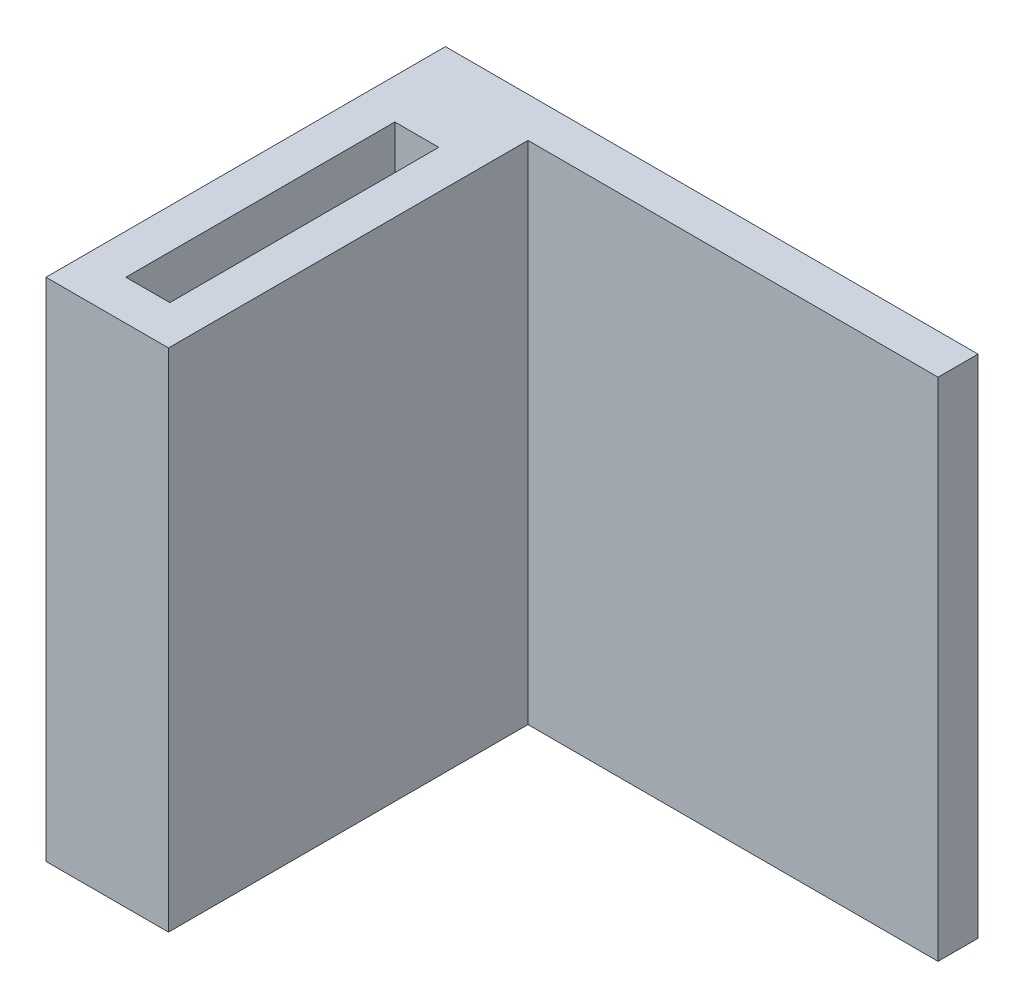
ISO-10303-21;
HEADER;
FILE_DESCRIPTION(('STEP AP214'),'2;1');
FILE_NAME('part.step','',(''),(''),'','','');
FILE_SCHEMA(('AUTOMOTIVE_DESIGN { 1 0 10303 214 1 1 1 1 }'));
ENDSEC;
DATA;
#1=APPLICATION_CONTEXT('core data for automotive mechanical design processes');
#2=APPLICATION_PROTOCOL_DEFINITION('international standard','automotive_design',2000,#1);
#3=PRODUCT_CONTEXT('',#1,'mechanical');
#4=PRODUCT('Part','Part','',(#3));
#5=PRODUCT_RELATED_PRODUCT_CATEGORY('part','',(#4));
#6=PRODUCT_DEFINITION_FORMATION('','',#4);
#7=PRODUCT_DEFINITION_CONTEXT('part definition',#1,'design');
#8=PRODUCT_DEFINITION('design','',#6,#7);
#9=PRODUCT_DEFINITION_SHAPE('','',#8);
#10=(LENGTH_UNIT() NAMED_UNIT(*) SI_UNIT(.MILLI.,.METRE.));
#11=(NAMED_UNIT(*) PLANE_ANGLE_UNIT() SI_UNIT($,.RADIAN.));
#12=(NAMED_UNIT(*) SI_UNIT($,.STERADIAN.) SOLID_ANGLE_UNIT());
#13=UNCERTAINTY_MEASURE_WITH_UNIT(LENGTH_MEASURE(1.E-05),#10,'distance_accuracy_value','');
#14=(GEOMETRIC_REPRESENTATION_CONTEXT(3) GLOBAL_UNCERTAINTY_ASSIGNED_CONTEXT((#13)) GLOBAL_UNIT_ASSIGNED_CONTEXT((#10,
#11,#12)) REPRESENTATION_CONTEXT('',''));
#15=CARTESIAN_POINT('',(0.,0.,0.));
#16=DIRECTION('',(0.,0.,1.));
#17=DIRECTION('',(1.,0.,0.));
#18=AXIS2_PLACEMENT_3D('',#15,#16,#17);
#19=CARTESIAN_POINT('',(4.6,4.5,-13.5));
#20=DIRECTION('',(1.,0.,0.));
#21=DIRECTION('',(0.,0.,-1.));
#22=AXIS2_PLACEMENT_3D('',#19,#20,#21);
#23=PLANE('',#22);
#24=DIRECTION('',(0.,0.,1.));
#25=VECTOR('',#24,1.);
#26=CARTESIAN_POINT('',(4.6,0.,-13.5));
#27=LINE('',#26,#25);
#28=CARTESIAN_POINT('',(4.6,0.,-13.5));
#29=VERTEX_POINT('',#28);
#30=CARTESIAN_POINT('',(4.6,0.,0.));
#31=VERTEX_POINT('',#30);
#32=EDGE_CURVE('E169',#29,#31,#27,.T.);
#33=ORIENTED_EDGE('',*,*,#32,.F.);
#34=DIRECTION('',(0.,-1.,0.));
#35=VECTOR('',#34,1.);
#36=CARTESIAN_POINT('',(4.6,4.5,-13.5));
#37=LINE('',#36,#35);
#38=CARTESIAN_POINT('',(4.6,19.,-13.5));
#39=VERTEX_POINT('',#38);
#40=EDGE_CURVE('E11',#39,#29,#37,.T.);
#41=ORIENTED_EDGE('',*,*,#40,.F.);
#42=DIRECTION('',(0.,0.,-1.));
#43=VECTOR('',#42,1.);
#44=CARTESIAN_POINT('',(4.6,19.,-13.5));
#45=LINE('',#44,#43);
#46=CARTESIAN_POINT('',(4.6,19.,0.));
#47=VERTEX_POINT('',#46);
#48=EDGE_CURVE('E145',#47,#39,#45,.T.);
#49=ORIENTED_EDGE('',*,*,#48,.F.);
#50=DIRECTION('',(0.,-1.,0.));
#51=VECTOR('',#50,1.);
#52=CARTESIAN_POINT('',(4.6,4.5,0.));
#53=LINE('',#52,#51);
#54=EDGE_CURVE('E36',#47,#31,#53,.T.);
#55=ORIENTED_EDGE('',*,*,#54,.T.);
#56=EDGE_LOOP('',(#33,#41,#49,#55));
#57=FACE_BOUND('',#56,.T.);
#58=ADVANCED_FACE('F33',(#57),#23,.T.);
#59=CARTESIAN_POINT('',(20.,4.5,-13.5));
#60=DIRECTION('',(0.,0.,1.));
#61=DIRECTION('',(1.,0.,0.));
#62=AXIS2_PLACEMENT_3D('',#59,#60,#61);
#63=PLANE('',#62);
#64=DIRECTION('',(-1.,0.,0.));
#65=VECTOR('',#64,1.);
#66=CARTESIAN_POINT('',(20.,0.,-13.5));
#67=LINE('',#66,#65);
#68=CARTESIAN_POINT('',(20.,0.,-13.5));
#69=VERTEX_POINT('',#68);
#70=EDGE_CURVE('E184',#69,#29,#67,.T.);
#71=ORIENTED_EDGE('',*,*,#70,.F.);
#72=DIRECTION('',(0.,-1.,0.));
#73=VECTOR('',#72,1.);
#74=CARTESIAN_POINT('',(20.,4.5,-13.5));
#75=LINE('',#74,#73);
#76=CARTESIAN_POINT('',(20.,19.,-13.5));
#77=VERTEX_POINT('',#76);
#78=EDGE_CURVE('E41',#77,#69,#75,.T.);
#79=ORIENTED_EDGE('',*,*,#78,.F.);
#80=DIRECTION('',(1.,0.,0.));
#81=VECTOR('',#80,1.);
#82=CARTESIAN_POINT('',(20.,19.,-13.5));
#83=LINE('',#82,#81);
#84=EDGE_CURVE('E148',#39,#77,#83,.T.);
#85=ORIENTED_EDGE('',*,*,#84,.F.);
#86=ORIENTED_EDGE('',*,*,#40,.T.);
#87=EDGE_LOOP('',(#71,#79,#85,#86));
#88=FACE_BOUND('',#87,.T.);
#89=ADVANCED_FACE('F202',(#88),#63,.T.);
#90=CARTESIAN_POINT('',(20.,4.5,-15.));
#91=DIRECTION('',(1.,0.,0.));
#92=DIRECTION('',(0.,0.,-1.));
#93=AXIS2_PLACEMENT_3D('',#90,#91,#92);
#94=PLANE('',#93);
#95=DIRECTION('',(0.,0.,1.));
#96=VECTOR('',#95,1.);
#97=CARTESIAN_POINT('',(20.,0.,-15.));
#98=LINE('',#97,#96);
#99=CARTESIAN_POINT('',(20.,0.,-15.));
#100=VERTEX_POINT('',#99);
#101=EDGE_CURVE('E181',#100,#69,#98,.T.);
#102=ORIENTED_EDGE('',*,*,#101,.F.);
#103=DIRECTION('',(0.,-1.,0.));
#104=VECTOR('',#103,1.);
#105=CARTESIAN_POINT('',(20.,4.5,-15.));
#106=LINE('',#105,#104);
#107=CARTESIAN_POINT('',(20.,19.,-15.));
#108=VERTEX_POINT('',#107);
#109=EDGE_CURVE('E188',#108,#100,#106,.T.);
#110=ORIENTED_EDGE('',*,*,#109,.F.);
#111=DIRECTION('',(0.,0.,-1.));
#112=VECTOR('',#111,1.);
#113=CARTESIAN_POINT('',(20.,19.,-15.));
#114=LINE('',#113,#112);
#115=EDGE_CURVE('E151',#77,#108,#114,.T.);
#116=ORIENTED_EDGE('',*,*,#115,.F.);
#117=ORIENTED_EDGE('',*,*,#78,.T.);
#118=EDGE_LOOP('',(#102,#110,#116,#117));
#119=FACE_BOUND('',#118,.T.);
#120=ADVANCED_FACE('F207',(#119),#94,.T.);
#121=CARTESIAN_POINT('',(0.,4.5,-15.));
#122=DIRECTION('',(0.,0.,-1.));
#123=DIRECTION('',(-1.,0.,0.));
#124=AXIS2_PLACEMENT_3D('',#121,#122,#123);
#125=PLANE('',#124);
#126=DIRECTION('',(1.,0.,0.));
#127=VECTOR('',#126,1.);
#128=CARTESIAN_POINT('',(0.,0.,-15.));
#129=LINE('',#128,#127);
#130=CARTESIAN_POINT('',(0.,0.,-15.));
#131=VERTEX_POINT('',#130);
#132=EDGE_CURVE('E178',#131,#100,#129,.T.);
#133=ORIENTED_EDGE('',*,*,#132,.F.);
#134=DIRECTION('',(0.,-1.,0.));
#135=VECTOR('',#134,1.);
#136=CARTESIAN_POINT('',(0.,4.5,-15.));
#137=LINE('',#136,#135);
#138=CARTESIAN_POINT('',(0.,19.,-15.));
#139=VERTEX_POINT('',#138);
#140=EDGE_CURVE('E190',#139,#131,#137,.T.);
#141=ORIENTED_EDGE('',*,*,#140,.F.);
#142=DIRECTION('',(-1.,0.,0.));
#143=VECTOR('',#142,1.);
#144=CARTESIAN_POINT('',(0.,19.,-15.));
#145=LINE('',#144,#143);
#146=EDGE_CURVE('E154',#108,#139,#145,.T.);
#147=ORIENTED_EDGE('',*,*,#146,.F.);
#148=ORIENTED_EDGE('',*,*,#109,.T.);
#149=EDGE_LOOP('',(#133,#141,#147,#148));
#150=FACE_BOUND('',#149,.T.);
#151=ADVANCED_FACE('F210',(#150),#125,.T.);
#152=CARTESIAN_POINT('',(0.,4.5,0.));
#153=DIRECTION('',(-1.,0.,0.));
#154=DIRECTION('',(0.,0.,1.));
#155=AXIS2_PLACEMENT_3D('',#152,#153,#154);
#156=PLANE('',#155);
#157=DIRECTION('',(0.,0.,-1.));
#158=VECTOR('',#157,1.);
#159=CARTESIAN_POINT('',(0.,0.,0.));
#160=LINE('',#159,#158);
#161=CARTESIAN_POINT('',(0.,0.,0.));
#162=VERTEX_POINT('',#161);
#163=EDGE_CURVE('E175',#162,#131,#160,.T.);
#164=ORIENTED_EDGE('',*,*,#163,.F.);
#165=DIRECTION('',(0.,-1.,0.));
#166=VECTOR('',#165,1.);
#167=CARTESIAN_POINT('',(0.,4.5,0.));
#168=LINE('',#167,#166);
#169=CARTESIAN_POINT('',(0.,19.,0.));
#170=VERTEX_POINT('',#169);
#171=EDGE_CURVE('E191',#170,#162,#168,.T.);
#172=ORIENTED_EDGE('',*,*,#171,.F.);
#173=DIRECTION('',(0.,0.,1.));
#174=VECTOR('',#173,1.);
#175=CARTESIAN_POINT('',(0.,19.,0.));
#176=LINE('',#175,#174);
#177=EDGE_CURVE('E157',#139,#170,#176,.T.);
#178=ORIENTED_EDGE('',*,*,#177,.F.);
#179=ORIENTED_EDGE('',*,*,#140,.T.);
#180=EDGE_LOOP('',(#164,#172,#178,#179));
#181=FACE_BOUND('',#180,.T.);
#182=ADVANCED_FACE('F213',(#181),#156,.T.);
#183=CARTESIAN_POINT('',(4.6,4.5,0.));
#184=DIRECTION('',(0.,0.,1.));
#185=DIRECTION('',(1.,0.,0.));
#186=AXIS2_PLACEMENT_3D('',#183,#184,#185);
#187=PLANE('',#186);
#188=DIRECTION('',(-1.,0.,0.));
#189=VECTOR('',#188,1.);
#190=CARTESIAN_POINT('',(4.6,0.,0.));
#191=LINE('',#190,#189);
#192=EDGE_CURVE('E172',#31,#162,#191,.T.);
#193=ORIENTED_EDGE('',*,*,#192,.F.);
#194=ORIENTED_EDGE('',*,*,#54,.F.);
#195=DIRECTION('',(1.,0.,0.));
#196=VECTOR('',#195,1.);
#197=CARTESIAN_POINT('',(4.6,19.,0.));
#198=LINE('',#197,#196);
#199=EDGE_CURVE('E126',#170,#47,#198,.T.);
#200=ORIENTED_EDGE('',*,*,#199,.F.);
#201=ORIENTED_EDGE('',*,*,#171,.T.);
#202=EDGE_LOOP('',(#193,#194,#200,#201));
#203=FACE_BOUND('',#202,.T.);
#204=ADVANCED_FACE('F198',(#203),#187,.T.);
#205=CARTESIAN_POINT('',(0.,0.,0.));
#206=DIRECTION('',(0.,-1.,0.));
#207=DIRECTION('',(0.,0.,-1.));
#208=AXIS2_PLACEMENT_3D('',#205,#206,#207);
#209=PLANE('',#208);
#210=ORIENTED_EDGE('',*,*,#32,.T.);
#211=ORIENTED_EDGE('',*,*,#192,.T.);
#212=ORIENTED_EDGE('',*,*,#163,.T.);
#213=ORIENTED_EDGE('',*,*,#132,.T.);
#214=ORIENTED_EDGE('',*,*,#101,.T.);
#215=ORIENTED_EDGE('',*,*,#70,.T.);
#216=EDGE_LOOP('',(#210,#211,#212,#213,#214,#215));
#217=FACE_BOUND('',#216,.T.);
#218=ADVANCED_FACE('F200',(#217),#209,.T.);
#219=CARTESIAN_POINT('',(1.5,19.,-1.5));
#220=DIRECTION('',(1.,0.,0.));
#221=DIRECTION('',(0.,0.,-1.));
#222=AXIS2_PLACEMENT_3D('',#219,#220,#221);
#223=PLANE('',#222);
#224=DIRECTION('',(0.,0.,1.));
#225=VECTOR('',#224,1.);
#226=CARTESIAN_POINT('',(1.5,4.5,0.));
#227=LINE('',#226,#225);
#228=CARTESIAN_POINT('',(1.5,4.5,-11.6));
#229=VERTEX_POINT('',#228);
#230=CARTESIAN_POINT('',(1.5,4.5,-1.5));
#231=VERTEX_POINT('',#230);
#232=EDGE_CURVE('E167',#229,#231,#227,.T.);
#233=ORIENTED_EDGE('',*,*,#232,.F.);
#234=DIRECTION('',(0.,-1.,0.));
#235=VECTOR('',#234,1.);
#236=CARTESIAN_POINT('',(1.5,19.,-11.6));
#237=LINE('',#236,#235);
#238=CARTESIAN_POINT('',(1.5,19.,-11.6));
#239=VERTEX_POINT('',#238);
#240=EDGE_CURVE('E49',#239,#229,#237,.T.);
#241=ORIENTED_EDGE('',*,*,#240,.F.);
#242=DIRECTION('',(0.,0.,1.));
#243=VECTOR('',#242,1.);
#244=CARTESIAN_POINT('',(1.5,19.,-1.5));
#245=LINE('',#244,#243);
#246=CARTESIAN_POINT('',(1.5,19.,-1.5));
#247=VERTEX_POINT('',#246);
#248=EDGE_CURVE('E110',#239,#247,#245,.T.);
#249=ORIENTED_EDGE('',*,*,#248,.T.);
#250=DIRECTION('',(0.,-1.,0.));
#251=VECTOR('',#250,1.);
#252=CARTESIAN_POINT('',(1.5,19.,-1.5));
#253=LINE('',#252,#251);
#254=EDGE_CURVE('E113',#247,#231,#253,.T.);
#255=ORIENTED_EDGE('',*,*,#254,.T.);
#256=EDGE_LOOP('',(#233,#241,#249,#255));
#257=FACE_BOUND('',#256,.T.);
#258=ADVANCED_FACE('F112',(#257),#223,.T.);
#259=CARTESIAN_POINT('',(1.5,19.,-1.5));
#260=DIRECTION('',(0.,0.,-1.));
#261=DIRECTION('',(-1.,0.,0.));
#262=AXIS2_PLACEMENT_3D('',#259,#260,#261);
#263=PLANE('',#262);
#264=DIRECTION('',(1.,0.,0.));
#265=VECTOR('',#264,1.);
#266=CARTESIAN_POINT('',(0.,4.5,-1.5));
#267=LINE('',#266,#265);
#268=CARTESIAN_POINT('',(3.15,4.5,-1.5));
#269=VERTEX_POINT('',#268);
#270=EDGE_CURVE('E125',#231,#269,#267,.T.);
#271=ORIENTED_EDGE('',*,*,#270,.F.);
#272=ORIENTED_EDGE('',*,*,#254,.F.);
#273=DIRECTION('',(1.,0.,0.));
#274=VECTOR('',#273,1.);
#275=CARTESIAN_POINT('',(1.5,19.,-1.5));
#276=LINE('',#275,#274);
#277=CARTESIAN_POINT('',(3.15,19.,-1.5));
#278=VERTEX_POINT('',#277);
#279=EDGE_CURVE('E118',#247,#278,#276,.T.);
#280=ORIENTED_EDGE('',*,*,#279,.T.);
#281=DIRECTION('',(0.,-1.,0.));
#282=VECTOR('',#281,1.);
#283=CARTESIAN_POINT('',(3.15,19.,-1.5));
#284=LINE('',#283,#282);
#285=EDGE_CURVE('E127',#278,#269,#284,.T.);
#286=ORIENTED_EDGE('',*,*,#285,.T.);
#287=EDGE_LOOP('',(#271,#272,#280,#286));
#288=FACE_BOUND('',#287,.T.);
#289=ADVANCED_FACE('F121',(#288),#263,.T.);
#290=CARTESIAN_POINT('',(3.15,19.,-1.5));
#291=DIRECTION('',(-1.,0.,0.));
#292=DIRECTION('',(0.,0.,1.));
#293=AXIS2_PLACEMENT_3D('',#290,#291,#292);
#294=PLANE('',#293);
#295=DIRECTION('',(0.,0.,-1.));
#296=VECTOR('',#295,1.);
#297=CARTESIAN_POINT('',(3.15,4.5,0.));
#298=LINE('',#297,#296);
#299=CARTESIAN_POINT('',(3.15,4.5,-11.6));
#300=VERTEX_POINT('',#299);
#301=EDGE_CURVE('E163',#269,#300,#298,.T.);
#302=ORIENTED_EDGE('',*,*,#301,.F.);
#303=ORIENTED_EDGE('',*,*,#285,.F.);
#304=DIRECTION('',(0.,0.,-1.));
#305=VECTOR('',#304,1.);
#306=CARTESIAN_POINT('',(3.15,19.,-1.5));
#307=LINE('',#306,#305);
#308=CARTESIAN_POINT('',(3.15,19.,-11.6));
#309=VERTEX_POINT('',#308);
#310=EDGE_CURVE('E132',#278,#309,#307,.T.);
#311=ORIENTED_EDGE('',*,*,#310,.T.);
#312=DIRECTION('',(0.,-1.,0.));
#313=VECTOR('',#312,1.);
#314=CARTESIAN_POINT('',(3.15,19.,-11.6));
#315=LINE('',#314,#313);
#316=EDGE_CURVE('E139',#309,#300,#315,.T.);
#317=ORIENTED_EDGE('',*,*,#316,.T.);
#318=EDGE_LOOP('',(#302,#303,#311,#317));
#319=FACE_BOUND('',#318,.T.);
#320=ADVANCED_FACE('F244',(#319),#294,.T.);
#321=CARTESIAN_POINT('',(1.5,19.,-11.6));
#322=DIRECTION('',(0.,0.,1.));
#323=DIRECTION('',(1.,0.,0.));
#324=AXIS2_PLACEMENT_3D('',#321,#322,#323);
#325=PLANE('',#324);
#326=DIRECTION('',(-1.,0.,0.));
#327=VECTOR('',#326,1.);
#328=CARTESIAN_POINT('',(0.,4.5,-11.6));
#329=LINE('',#328,#327);
#330=EDGE_CURVE('E160',#300,#229,#329,.T.);
#331=ORIENTED_EDGE('',*,*,#330,.F.);
#332=ORIENTED_EDGE('',*,*,#316,.F.);
#333=DIRECTION('',(-1.,0.,0.));
#334=VECTOR('',#333,1.);
#335=CARTESIAN_POINT('',(1.5,19.,-11.6));
#336=LINE('',#335,#334);
#337=EDGE_CURVE('E134',#309,#239,#336,.T.);
#338=ORIENTED_EDGE('',*,*,#337,.T.);
#339=ORIENTED_EDGE('',*,*,#240,.T.);
#340=EDGE_LOOP('',(#331,#332,#338,#339));
#341=FACE_BOUND('',#340,.T.);
#342=ADVANCED_FACE('F239',(#341),#325,.T.);
#343=CARTESIAN_POINT('',(0.,19.,0.));
#344=DIRECTION('',(0.,-1.,0.));
#345=DIRECTION('',(0.,0.,-1.));
#346=AXIS2_PLACEMENT_3D('',#343,#344,#345);
#347=PLANE('',#346);
#348=ORIENTED_EDGE('',*,*,#199,.T.);
#349=ORIENTED_EDGE('',*,*,#48,.T.);
#350=ORIENTED_EDGE('',*,*,#84,.T.);
#351=ORIENTED_EDGE('',*,*,#115,.T.);
#352=ORIENTED_EDGE('',*,*,#146,.T.);
#353=ORIENTED_EDGE('',*,*,#177,.T.);
#354=EDGE_LOOP('',(#348,#349,#350,#351,#352,#353));
#355=FACE_BOUND('',#354,.T.);
#356=ORIENTED_EDGE('',*,*,#248,.F.);
#357=ORIENTED_EDGE('',*,*,#337,.F.);
#358=ORIENTED_EDGE('',*,*,#310,.F.);
#359=ORIENTED_EDGE('',*,*,#279,.F.);
#360=EDGE_LOOP('',(#356,#357,#358,#359));
#361=FACE_BOUND('',#360,.T.);
#362=ADVANCED_FACE('F130',(#355,#361),#347,.F.);
#363=CARTESIAN_POINT('',(0.,4.5,0.));
#364=DIRECTION('',(0.,-1.,0.));
#365=DIRECTION('',(0.,0.,-1.));
#366=AXIS2_PLACEMENT_3D('',#363,#364,#365);
#367=PLANE('',#366);
#368=ORIENTED_EDGE('',*,*,#330,.T.);
#369=ORIENTED_EDGE('',*,*,#232,.T.);
#370=ORIENTED_EDGE('',*,*,#270,.T.);
#371=ORIENTED_EDGE('',*,*,#301,.T.);
#372=EDGE_LOOP('',(#368,#369,#370,#371));
#373=FACE_BOUND('',#372,.T.);
#374=ADVANCED_FACE('F233',(#373),#367,.F.);
#375=CLOSED_SHELL('',(#58,#89,#120,#151,#182,#204,#218,#258,#289,#320,#342,#362,#374));
#376=MANIFOLD_SOLID_BREP('B2',#375);
#377=ADVANCED_BREP_SHAPE_REPRESENTATION('',(#18,#376),#14);
#378=SHAPE_DEFINITION_REPRESENTATION(#9,#377);
ENDSEC;
END-ISO-10303-21;
